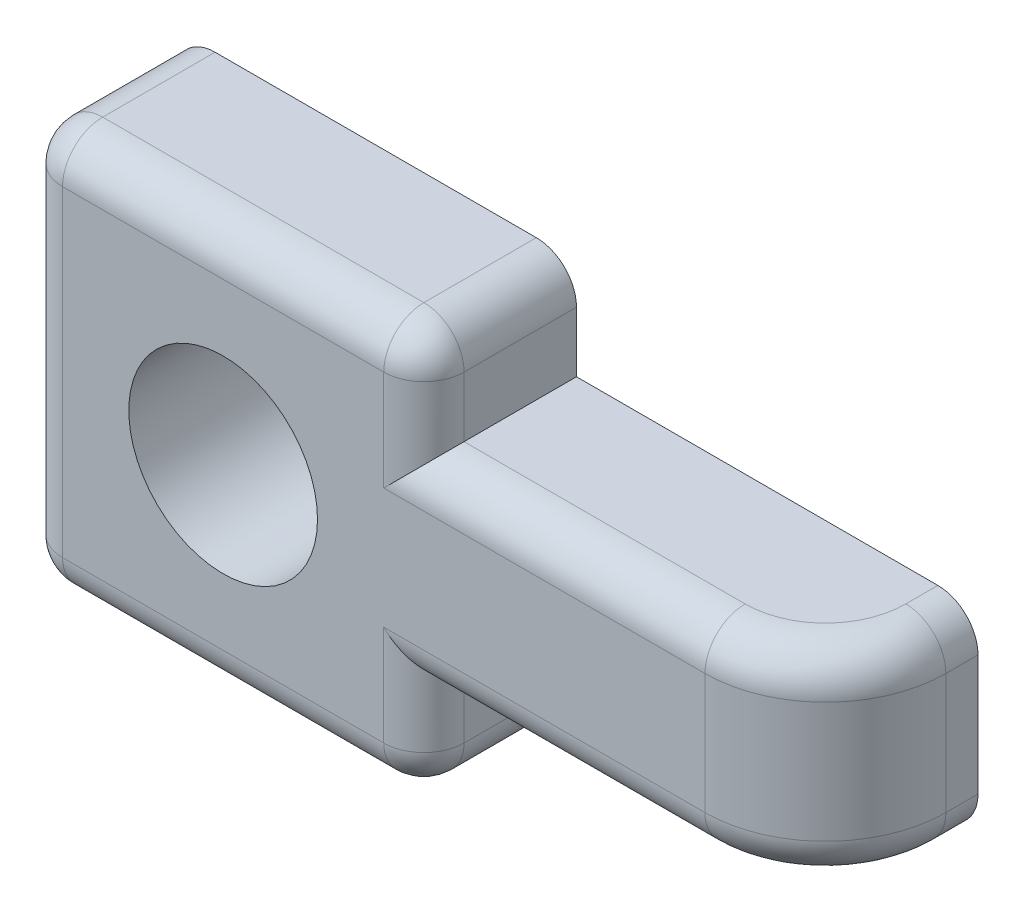
ISO-10303-21;
HEADER;
FILE_DESCRIPTION(('STEP AP214'),'2;1');
FILE_NAME('part.step','',(''),(''),'','','');
FILE_SCHEMA(('AUTOMOTIVE_DESIGN { 1 0 10303 214 1 1 1 1 }'));
ENDSEC;
DATA;
#1=APPLICATION_CONTEXT('core data for automotive mechanical design processes');
#2=APPLICATION_PROTOCOL_DEFINITION('international standard','automotive_design',2000,#1);
#3=PRODUCT_CONTEXT('',#1,'mechanical');
#4=PRODUCT('Part','Part','',(#3));
#5=PRODUCT_RELATED_PRODUCT_CATEGORY('part','',(#4));
#6=PRODUCT_DEFINITION_FORMATION('','',#4);
#7=PRODUCT_DEFINITION_CONTEXT('part definition',#1,'design');
#8=PRODUCT_DEFINITION('design','',#6,#7);
#9=PRODUCT_DEFINITION_SHAPE('','',#8);
#10=(LENGTH_UNIT() NAMED_UNIT(*) SI_UNIT(.MILLI.,.METRE.));
#11=(NAMED_UNIT(*) PLANE_ANGLE_UNIT() SI_UNIT($,.RADIAN.));
#12=(NAMED_UNIT(*) SI_UNIT($,.STERADIAN.) SOLID_ANGLE_UNIT());
#13=UNCERTAINTY_MEASURE_WITH_UNIT(LENGTH_MEASURE(1.E-05),#10,'distance_accuracy_value','');
#14=(GEOMETRIC_REPRESENTATION_CONTEXT(3) GLOBAL_UNCERTAINTY_ASSIGNED_CONTEXT((#13)) GLOBAL_UNIT_ASSIGNED_CONTEXT((#10,
#11,#12)) REPRESENTATION_CONTEXT('',''));
#15=CARTESIAN_POINT('',(0.,0.,0.));
#16=DIRECTION('',(0.,0.,1.));
#17=DIRECTION('',(1.,0.,0.));
#18=AXIS2_PLACEMENT_3D('',#15,#16,#17);
#19=CARTESIAN_POINT('',(0.,-25.,38.));
#20=DIRECTION('',(0.,1.,0.));
#21=DIRECTION('',(0.,0.,1.));
#22=AXIS2_PLACEMENT_3D('',#19,#20,#21);
#23=PLANE('',#22);
#24=DIRECTION('',(1.,0.,0.));
#25=VECTOR('',#24,1.);
#26=CARTESIAN_POINT('',(0.,-25.,0.));
#27=LINE('',#26,#25);
#28=CARTESIAN_POINT('',(50.,-25.,0.));
#29=VERTEX_POINT('',#28);
#30=CARTESIAN_POINT('',(140.,-25.,0.));
#31=VERTEX_POINT('',#30);
#32=EDGE_CURVE('E194',#29,#31,#27,.T.);
#33=ORIENTED_EDGE('',*,*,#32,.T.);
#34=DIRECTION('',(0.,0.,-1.));
#35=VECTOR('',#34,1.);
#36=CARTESIAN_POINT('',(140.,-25.,38.));
#37=LINE('',#36,#35);
#38=CARTESIAN_POINT('',(140.,-25.,8.00000000000002));
#39=VERTEX_POINT('',#38);
#40=EDGE_CURVE('E288',#31,#39,#37,.F.);
#41=ORIENTED_EDGE('',*,*,#40,.T.);
#42=CARTESIAN_POINT('',(120.,-25.,8.00000000000002));
#43=DIRECTION('',(0.,1.,0.));
#44=DIRECTION('',(0.,0.,1.));
#45=AXIS2_PLACEMENT_3D('',#42,#43,#44);
#46=CIRCLE('',#45,20.);
#47=CARTESIAN_POINT('',(120.,-25.,28.));
#48=VERTEX_POINT('',#47);
#49=EDGE_CURVE('E286',#39,#48,#46,.F.);
#50=ORIENTED_EDGE('',*,*,#49,.T.);
#51=DIRECTION('',(1.,0.,0.));
#52=VECTOR('',#51,1.);
#53=CARTESIAN_POINT('',(50.,-25.,28.));
#54=LINE('',#53,#52);
#55=CARTESIAN_POINT('',(50.,-25.,28.));
#56=VERTEX_POINT('',#55);
#57=EDGE_CURVE('E284',#48,#56,#54,.F.);
#58=ORIENTED_EDGE('',*,*,#57,.T.);
#59=DIRECTION('',(0.,0.,-1.));
#60=VECTOR('',#59,1.);
#61=CARTESIAN_POINT('',(50.,-25.,38.));
#62=LINE('',#61,#60);
#63=EDGE_CURVE('E176',#56,#29,#62,.T.);
#64=ORIENTED_EDGE('',*,*,#63,.T.);
#65=EDGE_LOOP('',(#33,#41,#50,#58,#64));
#66=FACE_BOUND('',#65,.T.);
#67=ADVANCED_FACE('F37',(#66),#23,.F.);
#68=CARTESIAN_POINT('',(150.,0.,38.));
#69=DIRECTION('',(-1.,0.,0.));
#70=DIRECTION('',(0.,0.,1.));
#71=AXIS2_PLACEMENT_3D('',#68,#69,#70);
#72=PLANE('',#71);
#73=DIRECTION('',(0.,1.,0.));
#74=VECTOR('',#73,1.);
#75=CARTESIAN_POINT('',(150.,-25.,8.00000000000002));
#76=LINE('',#75,#74);
#77=CARTESIAN_POINT('',(150.,15.,8.00000000000002));
#78=VERTEX_POINT('',#77);
#79=CARTESIAN_POINT('',(150.,-15.,8.00000000000002));
#80=VERTEX_POINT('',#79);
#81=EDGE_CURVE('E242',#78,#80,#76,.F.);
#82=ORIENTED_EDGE('',*,*,#81,.T.);
#83=DIRECTION('',(0.,0.,-1.));
#84=VECTOR('',#83,1.);
#85=CARTESIAN_POINT('',(150.,-15.,38.));
#86=LINE('',#85,#84);
#87=CARTESIAN_POINT('',(150.,-15.,0.));
#88=VERTEX_POINT('',#87);
#89=EDGE_CURVE('E278',#80,#88,#86,.T.);
#90=ORIENTED_EDGE('',*,*,#89,.T.);
#91=DIRECTION('',(0.,1.,0.));
#92=VECTOR('',#91,1.);
#93=CARTESIAN_POINT('',(150.,0.,0.));
#94=LINE('',#93,#92);
#95=CARTESIAN_POINT('',(150.,15.,0.));
#96=VERTEX_POINT('',#95);
#97=EDGE_CURVE('E191',#88,#96,#94,.T.);
#98=ORIENTED_EDGE('',*,*,#97,.T.);
#99=DIRECTION('',(0.,0.,-1.));
#100=VECTOR('',#99,1.);
#101=CARTESIAN_POINT('',(150.,15.,8.00000000000002));
#102=LINE('',#101,#100);
#103=EDGE_CURVE('E276',#96,#78,#102,.F.);
#104=ORIENTED_EDGE('',*,*,#103,.T.);
#105=EDGE_LOOP('',(#82,#90,#98,#104));
#106=FACE_BOUND('',#105,.T.);
#107=ADVANCED_FACE('F364',(#106),#72,.F.);
#108=CARTESIAN_POINT('',(0.,25.,38.));
#109=DIRECTION('',(0.,1.,0.));
#110=DIRECTION('',(0.,0.,1.));
#111=AXIS2_PLACEMENT_3D('',#108,#109,#110);
#112=PLANE('',#111);
#113=CARTESIAN_POINT('',(120.,25.,8.00000000000002));
#114=DIRECTION('',(0.,1.,0.));
#115=DIRECTION('',(0.,0.,1.));
#116=AXIS2_PLACEMENT_3D('',#113,#114,#115);
#117=CIRCLE('',#116,20.);
#118=CARTESIAN_POINT('',(120.,25.,28.));
#119=VERTEX_POINT('',#118);
#120=CARTESIAN_POINT('',(140.,25.,8.00000000000002));
#121=VERTEX_POINT('',#120);
#122=EDGE_CURVE('E54',#119,#121,#117,.T.);
#123=ORIENTED_EDGE('',*,*,#122,.T.);
#124=DIRECTION('',(0.,0.,-1.));
#125=VECTOR('',#124,1.);
#126=CARTESIAN_POINT('',(140.,25.,0.));
#127=LINE('',#126,#125);
#128=CARTESIAN_POINT('',(140.,25.,0.));
#129=VERTEX_POINT('',#128);
#130=EDGE_CURVE('E46',#121,#129,#127,.T.);
#131=ORIENTED_EDGE('',*,*,#130,.T.);
#132=DIRECTION('',(1.,0.,0.));
#133=VECTOR('',#132,1.);
#134=CARTESIAN_POINT('',(0.,25.,0.));
#135=LINE('',#134,#133);
#136=CARTESIAN_POINT('',(50.,25.,0.));
#137=VERTEX_POINT('',#136);
#138=EDGE_CURVE('E183',#137,#129,#135,.T.);
#139=ORIENTED_EDGE('',*,*,#138,.F.);
#140=DIRECTION('',(0.,0.,-1.));
#141=VECTOR('',#140,1.);
#142=CARTESIAN_POINT('',(50.,25.,38.));
#143=LINE('',#142,#141);
#144=CARTESIAN_POINT('',(50.,25.,28.));
#145=VERTEX_POINT('',#144);
#146=EDGE_CURVE('E167',#145,#137,#143,.T.);
#147=ORIENTED_EDGE('',*,*,#146,.F.);
#148=DIRECTION('',(1.,0.,0.));
#149=VECTOR('',#148,1.);
#150=CARTESIAN_POINT('',(0.,25.,28.));
#151=LINE('',#150,#149);
#152=EDGE_CURVE('E59',#145,#119,#151,.T.);
#153=ORIENTED_EDGE('',*,*,#152,.T.);
#154=EDGE_LOOP('',(#123,#131,#139,#147,#153));
#155=FACE_BOUND('',#154,.T.);
#156=ADVANCED_FACE('F190',(#155),#112,.T.);
#157=CARTESIAN_POINT('',(50.,0.,38.));
#158=DIRECTION('',(-1.,0.,0.));
#159=DIRECTION('',(0.,-1.,0.));
#160=AXIS2_PLACEMENT_3D('',#157,#158,#159);
#161=PLANE('',#160);
#162=DIRECTION('',(0.,0.,-1.));
#163=VECTOR('',#162,1.);
#164=CARTESIAN_POINT('',(50.,40.,38.));
#165=LINE('',#164,#163);
#166=CARTESIAN_POINT('',(50.,40.,0.));
#167=VERTEX_POINT('',#166);
#168=CARTESIAN_POINT('',(50.,40.,28.));
#169=VERTEX_POINT('',#168);
#170=EDGE_CURVE('E225',#167,#169,#165,.F.);
#171=ORIENTED_EDGE('',*,*,#170,.T.);
#172=DIRECTION('',(0.,1.,0.));
#173=VECTOR('',#172,1.);
#174=CARTESIAN_POINT('',(50.,25.,28.));
#175=LINE('',#174,#173);
#176=EDGE_CURVE('E11',#169,#145,#175,.F.);
#177=ORIENTED_EDGE('',*,*,#176,.T.);
#178=ORIENTED_EDGE('',*,*,#146,.T.);
#179=DIRECTION('',(0.,1.,0.));
#180=VECTOR('',#179,1.);
#181=CARTESIAN_POINT('',(50.,0.,0.));
#182=LINE('',#181,#180);
#183=EDGE_CURVE('E171',#137,#167,#182,.T.);
#184=ORIENTED_EDGE('',*,*,#183,.T.);
#185=EDGE_LOOP('',(#171,#177,#178,#184));
#186=FACE_BOUND('',#185,.T.);
#187=ADVANCED_FACE('F170',(#186),#161,.F.);
#188=CARTESIAN_POINT('',(0.,50.,38.));
#189=DIRECTION('',(0.,-1.,0.));
#190=DIRECTION('',(0.,0.,-1.));
#191=AXIS2_PLACEMENT_3D('',#188,#189,#190);
#192=PLANE('',#191);
#193=DIRECTION('',(0.,0.,-1.));
#194=VECTOR('',#193,1.);
#195=CARTESIAN_POINT('',(-40.,50.,38.));
#196=LINE('',#195,#194);
#197=CARTESIAN_POINT('',(-40.,50.,0.));
#198=VERTEX_POINT('',#197);
#199=CARTESIAN_POINT('',(-40.,50.,28.));
#200=VERTEX_POINT('',#199);
#201=EDGE_CURVE('E175',#198,#200,#196,.F.);
#202=ORIENTED_EDGE('',*,*,#201,.T.);
#203=DIRECTION('',(-1.,0.,0.));
#204=VECTOR('',#203,1.);
#205=CARTESIAN_POINT('',(40.,50.,28.));
#206=LINE('',#205,#204);
#207=CARTESIAN_POINT('',(40.,50.,28.));
#208=VERTEX_POINT('',#207);
#209=EDGE_CURVE('E272',#200,#208,#206,.F.);
#210=ORIENTED_EDGE('',*,*,#209,.T.);
#211=DIRECTION('',(0.,0.,-1.));
#212=VECTOR('',#211,1.);
#213=CARTESIAN_POINT('',(40.,50.,38.));
#214=LINE('',#213,#212);
#215=CARTESIAN_POINT('',(40.,50.,0.));
#216=VERTEX_POINT('',#215);
#217=EDGE_CURVE('E216',#208,#216,#214,.T.);
#218=ORIENTED_EDGE('',*,*,#217,.T.);
#219=DIRECTION('',(-1.,0.,0.));
#220=VECTOR('',#219,1.);
#221=CARTESIAN_POINT('',(0.,50.,0.));
#222=LINE('',#221,#220);
#223=EDGE_CURVE('E188',#216,#198,#222,.T.);
#224=ORIENTED_EDGE('',*,*,#223,.T.);
#225=EDGE_LOOP('',(#202,#210,#218,#224));
#226=FACE_BOUND('',#225,.T.);
#227=ADVANCED_FACE('F500',(#226),#192,.F.);
#228=CARTESIAN_POINT('',(-50.,0.,38.));
#229=DIRECTION('',(-1.,0.,0.));
#230=DIRECTION('',(0.,-1.,0.));
#231=AXIS2_PLACEMENT_3D('',#228,#229,#230);
#232=PLANE('',#231);
#233=DIRECTION('',(0.,0.,-1.));
#234=VECTOR('',#233,1.);
#235=CARTESIAN_POINT('',(-50.,-40.,38.));
#236=LINE('',#235,#234);
#237=CARTESIAN_POINT('',(-50.,-40.,0.));
#238=VERTEX_POINT('',#237);
#239=CARTESIAN_POINT('',(-50.,-40.,28.));
#240=VERTEX_POINT('',#239);
#241=EDGE_CURVE('E236',#238,#240,#236,.F.);
#242=ORIENTED_EDGE('',*,*,#241,.T.);
#243=DIRECTION('',(0.,1.,0.));
#244=VECTOR('',#243,1.);
#245=CARTESIAN_POINT('',(-50.,0.,28.));
#246=LINE('',#245,#244);
#247=CARTESIAN_POINT('',(-50.,40.,28.));
#248=VERTEX_POINT('',#247);
#249=EDGE_CURVE('E268',#240,#248,#246,.T.);
#250=ORIENTED_EDGE('',*,*,#249,.T.);
#251=DIRECTION('',(0.,0.,-1.));
#252=VECTOR('',#251,1.);
#253=CARTESIAN_POINT('',(-50.,40.,0.));
#254=LINE('',#253,#252);
#255=CARTESIAN_POINT('',(-50.,40.,0.));
#256=VERTEX_POINT('',#255);
#257=EDGE_CURVE('E234',#248,#256,#254,.T.);
#258=ORIENTED_EDGE('',*,*,#257,.T.);
#259=DIRECTION('',(0.,1.,0.));
#260=VECTOR('',#259,1.);
#261=CARTESIAN_POINT('',(-50.,0.,0.));
#262=LINE('',#261,#260);
#263=EDGE_CURVE('E200',#238,#256,#262,.T.);
#264=ORIENTED_EDGE('',*,*,#263,.F.);
#265=EDGE_LOOP('',(#242,#250,#258,#264));
#266=FACE_BOUND('',#265,.T.);
#267=ADVANCED_FACE('F485',(#266),#232,.T.);
#268=CARTESIAN_POINT('',(0.,-50.,38.));
#269=DIRECTION('',(0.,-1.,0.));
#270=DIRECTION('',(0.,0.,-1.));
#271=AXIS2_PLACEMENT_3D('',#268,#269,#270);
#272=PLANE('',#271);
#273=DIRECTION('',(0.,0.,-1.));
#274=VECTOR('',#273,1.);
#275=CARTESIAN_POINT('',(40.,-50.,38.));
#276=LINE('',#275,#274);
#277=CARTESIAN_POINT('',(40.,-50.,0.));
#278=VERTEX_POINT('',#277);
#279=CARTESIAN_POINT('',(40.,-50.,28.));
#280=VERTEX_POINT('',#279);
#281=EDGE_CURVE('E231',#278,#280,#276,.F.);
#282=ORIENTED_EDGE('',*,*,#281,.T.);
#283=DIRECTION('',(-1.,0.,0.));
#284=VECTOR('',#283,1.);
#285=CARTESIAN_POINT('',(0.,-50.,28.));
#286=LINE('',#285,#284);
#287=CARTESIAN_POINT('',(-40.,-50.,28.));
#288=VERTEX_POINT('',#287);
#289=EDGE_CURVE('E264',#280,#288,#286,.T.);
#290=ORIENTED_EDGE('',*,*,#289,.T.);
#291=DIRECTION('',(0.,0.,-1.));
#292=VECTOR('',#291,1.);
#293=CARTESIAN_POINT('',(-40.,-50.,38.));
#294=LINE('',#293,#292);
#295=CARTESIAN_POINT('',(-40.,-50.,0.));
#296=VERTEX_POINT('',#295);
#297=EDGE_CURVE('E229',#288,#296,#294,.T.);
#298=ORIENTED_EDGE('',*,*,#297,.T.);
#299=DIRECTION('',(-1.,0.,0.));
#300=VECTOR('',#299,1.);
#301=CARTESIAN_POINT('',(0.,-50.,0.));
#302=LINE('',#301,#300);
#303=EDGE_CURVE('E203',#278,#296,#302,.T.);
#304=ORIENTED_EDGE('',*,*,#303,.F.);
#305=EDGE_LOOP('',(#282,#290,#298,#304));
#306=FACE_BOUND('',#305,.T.);
#307=ADVANCED_FACE('F479',(#306),#272,.T.);
#308=CARTESIAN_POINT('',(50.,0.,38.));
#309=DIRECTION('',(-1.,0.,0.));
#310=DIRECTION('',(0.,-1.,0.));
#311=AXIS2_PLACEMENT_3D('',#308,#309,#310);
#312=PLANE('',#311);
#313=ORIENTED_EDGE('',*,*,#63,.F.);
#314=DIRECTION('',(0.,1.,0.));
#315=VECTOR('',#314,1.);
#316=CARTESIAN_POINT('',(50.,-40.,28.));
#317=LINE('',#316,#315);
#318=CARTESIAN_POINT('',(50.,-40.,28.));
#319=VERTEX_POINT('',#318);
#320=EDGE_CURVE('E260',#56,#319,#317,.F.);
#321=ORIENTED_EDGE('',*,*,#320,.T.);
#322=DIRECTION('',(0.,0.,-1.));
#323=VECTOR('',#322,1.);
#324=CARTESIAN_POINT('',(50.,-40.,0.));
#325=LINE('',#324,#323);
#326=CARTESIAN_POINT('',(50.,-40.,0.));
#327=VERTEX_POINT('',#326);
#328=EDGE_CURVE('E227',#319,#327,#325,.T.);
#329=ORIENTED_EDGE('',*,*,#328,.T.);
#330=DIRECTION('',(0.,1.,0.));
#331=VECTOR('',#330,1.);
#332=CARTESIAN_POINT('',(50.,0.,0.));
#333=LINE('',#332,#331);
#334=EDGE_CURVE('E206',#327,#29,#333,.T.);
#335=ORIENTED_EDGE('',*,*,#334,.T.);
#336=EDGE_LOOP('',(#313,#321,#329,#335));
#337=FACE_BOUND('',#336,.T.);
#338=ADVANCED_FACE('F361',(#337),#312,.F.);
#339=CARTESIAN_POINT('',(0.,0.,38.));
#340=DIRECTION('',(0.,0.,-1.));
#341=DIRECTION('',(-1.,0.,0.));
#342=AXIS2_PLACEMENT_3D('',#339,#340,#341);
#343=CYLINDRICAL_SURFACE('',#342,23.5);
#344=CARTESIAN_POINT('',(0.,0.,38.));
#345=DIRECTION('',(0.,0.,1.));
#346=DIRECTION('',(1.,0.,0.));
#347=AXIS2_PLACEMENT_3D('',#344,#345,#346);
#348=CIRCLE('',#347,23.5);
#349=CARTESIAN_POINT('',(23.5,0.,38.));
#350=VERTEX_POINT('',#349);
#351=EDGE_CURVE('E212',#350,#350,#348,.T.);
#352=ORIENTED_EDGE('',*,*,#351,.T.);
#353=EDGE_LOOP('',(#352));
#354=FACE_BOUND('',#353,.T.);
#355=CARTESIAN_POINT('',(0.,0.,0.));
#356=DIRECTION('',(0.,0.,1.));
#357=DIRECTION('',(1.,0.,0.));
#358=AXIS2_PLACEMENT_3D('',#355,#356,#357);
#359=CIRCLE('',#358,23.5);
#360=CARTESIAN_POINT('',(23.5,0.,0.));
#361=VERTEX_POINT('',#360);
#362=EDGE_CURVE('E209',#361,#361,#359,.T.);
#363=ORIENTED_EDGE('',*,*,#362,.F.);
#364=EDGE_LOOP('',(#363));
#365=FACE_BOUND('',#364,.T.);
#366=ADVANCED_FACE('F348',(#354,#365),#343,.F.);
#367=CARTESIAN_POINT('',(0.,0.,38.));
#368=DIRECTION('',(0.,0.,1.));
#369=DIRECTION('',(1.,0.,0.));
#370=AXIS2_PLACEMENT_3D('',#367,#368,#369);
#371=PLANE('',#370);
#372=DIRECTION('',(0.,1.,0.));
#373=VECTOR('',#372,1.);
#374=CARTESIAN_POINT('',(40.,-25.,38.));
#375=LINE('',#374,#373);
#376=CARTESIAN_POINT('',(40.,-40.,38.));
#377=VERTEX_POINT('',#376);
#378=CARTESIAN_POINT('',(40.,-15.,38.));
#379=VERTEX_POINT('',#378);
#380=EDGE_CURVE('E255',#377,#379,#375,.T.);
#381=ORIENTED_EDGE('',*,*,#380,.T.);
#382=DIRECTION('',(1.,0.,0.));
#383=VECTOR('',#382,1.);
#384=CARTESIAN_POINT('',(120.,-15.,38.));
#385=LINE('',#384,#383);
#386=CARTESIAN_POINT('',(120.,-15.,38.));
#387=VERTEX_POINT('',#386);
#388=EDGE_CURVE('E258',#379,#387,#385,.T.);
#389=ORIENTED_EDGE('',*,*,#388,.T.);
#390=DIRECTION('',(0.,1.,0.));
#391=VECTOR('',#390,1.);
#392=CARTESIAN_POINT('',(120.,25.,38.));
#393=LINE('',#392,#391);
#394=CARTESIAN_POINT('',(120.,15.,38.));
#395=VERTEX_POINT('',#394);
#396=EDGE_CURVE('E239',#387,#395,#393,.T.);
#397=ORIENTED_EDGE('',*,*,#396,.T.);
#398=DIRECTION('',(1.,0.,0.));
#399=VECTOR('',#398,1.);
#400=CARTESIAN_POINT('',(0.,15.,38.));
#401=LINE('',#400,#399);
#402=CARTESIAN_POINT('',(40.,15.,38.));
#403=VERTEX_POINT('',#402);
#404=EDGE_CURVE('E245',#395,#403,#401,.F.);
#405=ORIENTED_EDGE('',*,*,#404,.T.);
#406=DIRECTION('',(0.,1.,0.));
#407=VECTOR('',#406,1.);
#408=CARTESIAN_POINT('',(40.,40.,38.));
#409=LINE('',#408,#407);
#410=CARTESIAN_POINT('',(40.,40.,38.));
#411=VERTEX_POINT('',#410);
#412=EDGE_CURVE('E247',#403,#411,#409,.T.);
#413=ORIENTED_EDGE('',*,*,#412,.T.);
#414=DIRECTION('',(-1.,0.,0.));
#415=VECTOR('',#414,1.);
#416=CARTESIAN_POINT('',(-40.,40.,38.));
#417=LINE('',#416,#415);
#418=CARTESIAN_POINT('',(-40.,40.,38.));
#419=VERTEX_POINT('',#418);
#420=EDGE_CURVE('E249',#411,#419,#417,.T.);
#421=ORIENTED_EDGE('',*,*,#420,.T.);
#422=DIRECTION('',(0.,1.,0.));
#423=VECTOR('',#422,1.);
#424=CARTESIAN_POINT('',(-40.,0.,38.));
#425=LINE('',#424,#423);
#426=CARTESIAN_POINT('',(-40.,-40.,38.));
#427=VERTEX_POINT('',#426);
#428=EDGE_CURVE('E251',#419,#427,#425,.F.);
#429=ORIENTED_EDGE('',*,*,#428,.T.);
#430=DIRECTION('',(-1.,0.,0.));
#431=VECTOR('',#430,1.);
#432=CARTESIAN_POINT('',(0.,-40.,38.));
#433=LINE('',#432,#431);
#434=EDGE_CURVE('E253',#427,#377,#433,.F.);
#435=ORIENTED_EDGE('',*,*,#434,.T.);
#436=EDGE_LOOP('',(#381,#389,#397,#405,#413,#421,#429,#435));
#437=FACE_BOUND('',#436,.T.);
#438=ORIENTED_EDGE('',*,*,#351,.F.);
#439=EDGE_LOOP('',(#438));
#440=FACE_BOUND('',#439,.T.);
#441=ADVANCED_FACE('F351',(#437,#440),#371,.T.);
#442=CARTESIAN_POINT('',(0.,0.,0.));
#443=DIRECTION('',(0.,0.,1.));
#444=DIRECTION('',(1.,0.,0.));
#445=AXIS2_PLACEMENT_3D('',#442,#443,#444);
#446=PLANE('',#445);
#447=ORIENTED_EDGE('',*,*,#97,.F.);
#448=CARTESIAN_POINT('',(140.,-15.,0.));
#449=DIRECTION('',(0.,0.,1.));
#450=DIRECTION('',(1.,0.,0.));
#451=AXIS2_PLACEMENT_3D('',#448,#449,#450);
#452=CIRCLE('',#451,10.);
#453=EDGE_CURVE('E282',#88,#31,#452,.F.);
#454=ORIENTED_EDGE('',*,*,#453,.T.);
#455=ORIENTED_EDGE('',*,*,#32,.F.);
#456=ORIENTED_EDGE('',*,*,#334,.F.);
#457=CARTESIAN_POINT('',(40.,-40.,0.));
#458=DIRECTION('',(0.,0.,1.));
#459=DIRECTION('',(1.,0.,0.));
#460=AXIS2_PLACEMENT_3D('',#457,#458,#459);
#461=CIRCLE('',#460,10.);
#462=EDGE_CURVE('E222',#327,#278,#461,.F.);
#463=ORIENTED_EDGE('',*,*,#462,.T.);
#464=ORIENTED_EDGE('',*,*,#303,.T.);
#465=CARTESIAN_POINT('',(-40.,-40.,0.));
#466=DIRECTION('',(0.,0.,1.));
#467=DIRECTION('',(1.,0.,0.));
#468=AXIS2_PLACEMENT_3D('',#465,#466,#467);
#469=CIRCLE('',#468,10.);
#470=EDGE_CURVE('E220',#296,#238,#469,.F.);
#471=ORIENTED_EDGE('',*,*,#470,.T.);
#472=ORIENTED_EDGE('',*,*,#263,.T.);
#473=CARTESIAN_POINT('',(-40.,40.,0.));
#474=DIRECTION('',(0.,0.,1.));
#475=DIRECTION('',(1.,0.,0.));
#476=AXIS2_PLACEMENT_3D('',#473,#474,#475);
#477=CIRCLE('',#476,10.);
#478=EDGE_CURVE('E218',#256,#198,#477,.F.);
#479=ORIENTED_EDGE('',*,*,#478,.T.);
#480=ORIENTED_EDGE('',*,*,#223,.F.);
#481=CARTESIAN_POINT('',(40.,40.,0.));
#482=DIRECTION('',(0.,0.,1.));
#483=DIRECTION('',(1.,0.,0.));
#484=AXIS2_PLACEMENT_3D('',#481,#482,#483);
#485=CIRCLE('',#484,10.);
#486=EDGE_CURVE('E187',#216,#167,#485,.F.);
#487=ORIENTED_EDGE('',*,*,#486,.T.);
#488=ORIENTED_EDGE('',*,*,#183,.F.);
#489=ORIENTED_EDGE('',*,*,#138,.T.);
#490=CARTESIAN_POINT('',(140.,15.,0.));
#491=DIRECTION('',(0.,0.,1.));
#492=DIRECTION('',(1.,0.,0.));
#493=AXIS2_PLACEMENT_3D('',#490,#491,#492);
#494=CIRCLE('',#493,10.);
#495=EDGE_CURVE('E280',#129,#96,#494,.F.);
#496=ORIENTED_EDGE('',*,*,#495,.T.);
#497=EDGE_LOOP('',(#447,#454,#455,#456,#463,#464,#471,#472,#479,#480,#487,#488,#489,#496));
#498=FACE_BOUND('',#497,.T.);
#499=ORIENTED_EDGE('',*,*,#362,.T.);
#500=EDGE_LOOP('',(#499));
#501=FACE_BOUND('',#500,.T.);
#502=ADVANCED_FACE('F181',(#498,#501),#446,.F.);
#503=CARTESIAN_POINT('',(40.,40.,38.));
#504=DIRECTION('',(0.,0.,-1.));
#505=DIRECTION('',(-1.,0.,0.));
#506=AXIS2_PLACEMENT_3D('',#503,#504,#505);
#507=CYLINDRICAL_SURFACE('',#506,10.);
#508=ORIENTED_EDGE('',*,*,#217,.F.);
#509=CARTESIAN_POINT('',(40.,40.,28.));
#510=DIRECTION('',(0.,0.,-1.));
#511=DIRECTION('',(-1.,0.,0.));
#512=AXIS2_PLACEMENT_3D('',#509,#510,#511);
#513=CIRCLE('',#512,10.);
#514=EDGE_CURVE('E274',#208,#169,#513,.T.);
#515=ORIENTED_EDGE('',*,*,#514,.T.);
#516=ORIENTED_EDGE('',*,*,#170,.F.);
#517=ORIENTED_EDGE('',*,*,#486,.F.);
#518=EDGE_LOOP('',(#508,#515,#516,#517));
#519=FACE_BOUND('',#518,.T.);
#520=ADVANCED_FACE('F359',(#519),#507,.T.);
#521=CARTESIAN_POINT('',(40.,-40.,38.));
#522=DIRECTION('',(0.,0.,1.));
#523=DIRECTION('',(1.,0.,0.));
#524=AXIS2_PLACEMENT_3D('',#521,#522,#523);
#525=CYLINDRICAL_SURFACE('',#524,10.);
#526=ORIENTED_EDGE('',*,*,#328,.F.);
#527=CARTESIAN_POINT('',(40.,-40.,28.));
#528=DIRECTION('',(0.,0.,1.));
#529=DIRECTION('',(1.,0.,0.));
#530=AXIS2_PLACEMENT_3D('',#527,#528,#529);
#531=CIRCLE('',#530,10.);
#532=EDGE_CURVE('E262',#319,#280,#531,.F.);
#533=ORIENTED_EDGE('',*,*,#532,.T.);
#534=ORIENTED_EDGE('',*,*,#281,.F.);
#535=ORIENTED_EDGE('',*,*,#462,.F.);
#536=EDGE_LOOP('',(#526,#533,#534,#535));
#537=FACE_BOUND('',#536,.T.);
#538=ADVANCED_FACE('F375',(#537),#525,.T.);
#539=CARTESIAN_POINT('',(-40.,-40.,38.));
#540=DIRECTION('',(0.,0.,-1.));
#541=DIRECTION('',(-1.,0.,0.));
#542=AXIS2_PLACEMENT_3D('',#539,#540,#541);
#543=CYLINDRICAL_SURFACE('',#542,10.);
#544=ORIENTED_EDGE('',*,*,#297,.F.);
#545=CARTESIAN_POINT('',(-40.,-40.,28.));
#546=DIRECTION('',(0.,0.,-1.));
#547=DIRECTION('',(-1.,0.,0.));
#548=AXIS2_PLACEMENT_3D('',#545,#546,#547);
#549=CIRCLE('',#548,10.);
#550=EDGE_CURVE('E266',#288,#240,#549,.T.);
#551=ORIENTED_EDGE('',*,*,#550,.T.);
#552=ORIENTED_EDGE('',*,*,#241,.F.);
#553=ORIENTED_EDGE('',*,*,#470,.F.);
#554=EDGE_LOOP('',(#544,#551,#552,#553));
#555=FACE_BOUND('',#554,.T.);
#556=ADVANCED_FACE('F379',(#555),#543,.T.);
#557=CARTESIAN_POINT('',(-40.,40.,38.));
#558=DIRECTION('',(0.,0.,1.));
#559=DIRECTION('',(1.,0.,0.));
#560=AXIS2_PLACEMENT_3D('',#557,#558,#559);
#561=CYLINDRICAL_SURFACE('',#560,10.);
#562=ORIENTED_EDGE('',*,*,#257,.F.);
#563=CARTESIAN_POINT('',(-40.,40.,28.));
#564=DIRECTION('',(0.,0.,1.));
#565=DIRECTION('',(1.,0.,0.));
#566=AXIS2_PLACEMENT_3D('',#563,#564,#565);
#567=CIRCLE('',#566,10.);
#568=EDGE_CURVE('E270',#248,#200,#567,.F.);
#569=ORIENTED_EDGE('',*,*,#568,.T.);
#570=ORIENTED_EDGE('',*,*,#201,.F.);
#571=ORIENTED_EDGE('',*,*,#478,.F.);
#572=EDGE_LOOP('',(#562,#569,#570,#571));
#573=FACE_BOUND('',#572,.T.);
#574=ADVANCED_FACE('F383',(#573),#561,.T.);
#575=CARTESIAN_POINT('',(120.,0.,8.00000000000002));
#576=DIRECTION('',(0.,-1.,0.));
#577=DIRECTION('',(0.,0.,-1.));
#578=AXIS2_PLACEMENT_3D('',#575,#576,#577);
#579=CYLINDRICAL_SURFACE('',#578,30.);
#580=ORIENTED_EDGE('',*,*,#396,.F.);
#581=CARTESIAN_POINT('',(120.,-15.,8.00000000000002));
#582=DIRECTION('',(0.,1.,0.));
#583=DIRECTION('',(0.,0.,1.));
#584=AXIS2_PLACEMENT_3D('',#581,#582,#583);
#585=CIRCLE('',#584,30.);
#586=EDGE_CURVE('E292',#387,#80,#585,.T.);
#587=ORIENTED_EDGE('',*,*,#586,.T.);
#588=ORIENTED_EDGE('',*,*,#81,.F.);
#589=CARTESIAN_POINT('',(120.,15.,8.00000000000002));
#590=DIRECTION('',(0.,1.,0.));
#591=DIRECTION('',(0.,0.,1.));
#592=AXIS2_PLACEMENT_3D('',#589,#590,#591);
#593=CIRCLE('',#592,30.);
#594=EDGE_CURVE('E290',#78,#395,#593,.F.);
#595=ORIENTED_EDGE('',*,*,#594,.T.);
#596=EDGE_LOOP('',(#580,#587,#588,#595));
#597=FACE_BOUND('',#596,.T.);
#598=ADVANCED_FACE('F387',(#597),#579,.T.);
#599=CARTESIAN_POINT('',(140.,15.,38.));
#600=DIRECTION('',(0.,0.,1.));
#601=DIRECTION('',(1.,0.,0.));
#602=AXIS2_PLACEMENT_3D('',#599,#600,#601);
#603=CYLINDRICAL_SURFACE('',#602,10.);
#604=ORIENTED_EDGE('',*,*,#495,.F.);
#605=ORIENTED_EDGE('',*,*,#130,.F.);
#606=CARTESIAN_POINT('',(140.,15.,8.00000000000002));
#607=DIRECTION('',(0.,0.,1.));
#608=DIRECTION('',(1.,0.,0.));
#609=AXIS2_PLACEMENT_3D('',#606,#607,#608);
#610=CIRCLE('',#609,10.);
#611=EDGE_CURVE('E41',#78,#121,#610,.T.);
#612=ORIENTED_EDGE('',*,*,#611,.F.);
#613=ORIENTED_EDGE('',*,*,#103,.F.);
#614=EDGE_LOOP('',(#604,#605,#612,#613));
#615=FACE_BOUND('',#614,.T.);
#616=ADVANCED_FACE('F39',(#615),#603,.T.);
#617=CARTESIAN_POINT('',(120.,15.,8.00000000000002));
#618=DIRECTION('',(0.,1.,0.));
#619=DIRECTION('',(0.,0.,1.));
#620=AXIS2_PLACEMENT_3D('',#617,#618,#619);
#621=TOROIDAL_SURFACE('',#620,20.,10.);
#622=ORIENTED_EDGE('',*,*,#611,.T.);
#623=ORIENTED_EDGE('',*,*,#122,.F.);
#624=CARTESIAN_POINT('',(120.,15.,28.));
#625=DIRECTION('',(-1.,0.,0.));
#626=DIRECTION('',(0.,0.,1.));
#627=AXIS2_PLACEMENT_3D('',#624,#625,#626);
#628=CIRCLE('',#627,10.);
#629=EDGE_CURVE('E331',#395,#119,#628,.T.);
#630=ORIENTED_EDGE('',*,*,#629,.F.);
#631=ORIENTED_EDGE('',*,*,#594,.F.);
#632=EDGE_LOOP('',(#622,#623,#630,#631));
#633=FACE_BOUND('',#632,.T.);
#634=ADVANCED_FACE('F442',(#633),#621,.T.);
#635=CARTESIAN_POINT('',(0.,15.,28.));
#636=DIRECTION('',(1.,0.,0.));
#637=DIRECTION('',(0.,0.,-1.));
#638=AXIS2_PLACEMENT_3D('',#635,#636,#637);
#639=CYLINDRICAL_SURFACE('',#638,10.);
#640=ORIENTED_EDGE('',*,*,#629,.T.);
#641=ORIENTED_EDGE('',*,*,#152,.F.);
#642=CARTESIAN_POINT('',(40.,15.,28.));
#643=DIRECTION('',(0.707106781186548,-0.707106781186547,0.));
#644=DIRECTION('',(-0.707106781186547,-0.707106781186548,0.));
#645=AXIS2_PLACEMENT_3D('',#642,#643,#644);
#646=ELLIPSE('',#645,14.1421356237309,10.);
#647=EDGE_CURVE('E329',#403,#145,#646,.F.);
#648=ORIENTED_EDGE('',*,*,#647,.F.);
#649=ORIENTED_EDGE('',*,*,#404,.F.);
#650=EDGE_LOOP('',(#640,#641,#648,#649));
#651=FACE_BOUND('',#650,.T.);
#652=ADVANCED_FACE('F439',(#651),#639,.T.);
#653=CARTESIAN_POINT('',(40.,0.,28.));
#654=DIRECTION('',(0.,-1.,0.));
#655=DIRECTION('',(1.,0.,0.));
#656=AXIS2_PLACEMENT_3D('',#653,#654,#655);
#657=CYLINDRICAL_SURFACE('',#656,10.);
#658=ORIENTED_EDGE('',*,*,#647,.T.);
#659=ORIENTED_EDGE('',*,*,#176,.F.);
#660=CARTESIAN_POINT('',(40.,40.,28.));
#661=DIRECTION('',(0.,1.,0.));
#662=DIRECTION('',(0.,0.,1.));
#663=AXIS2_PLACEMENT_3D('',#660,#661,#662);
#664=CIRCLE('',#663,10.);
#665=EDGE_CURVE('E326',#411,#169,#664,.T.);
#666=ORIENTED_EDGE('',*,*,#665,.F.);
#667=ORIENTED_EDGE('',*,*,#412,.F.);
#668=EDGE_LOOP('',(#658,#659,#666,#667));
#669=FACE_BOUND('',#668,.T.);
#670=ADVANCED_FACE('F435',(#669),#657,.T.);
#671=CARTESIAN_POINT('',(40.,40.,28.));
#672=DIRECTION('',(0.,0.,1.));
#673=DIRECTION('',(1.,0.,0.));
#674=AXIS2_PLACEMENT_3D('',#671,#672,#673);
#675=SPHERICAL_SURFACE('',#674,10.);
#676=ORIENTED_EDGE('',*,*,#665,.T.);
#677=ORIENTED_EDGE('',*,*,#514,.F.);
#678=CARTESIAN_POINT('',(40.,40.,28.));
#679=DIRECTION('',(-1.,0.,0.));
#680=DIRECTION('',(0.,0.,1.));
#681=AXIS2_PLACEMENT_3D('',#678,#679,#680);
#682=CIRCLE('',#681,10.);
#683=EDGE_CURVE('E323',#411,#208,#682,.T.);
#684=ORIENTED_EDGE('',*,*,#683,.F.);
#685=EDGE_LOOP('',(#676,#677,#684));
#686=FACE_BOUND('',#685,.T.);
#687=ADVANCED_FACE('F431',(#686),#675,.T.);
#688=CARTESIAN_POINT('',(0.,40.,28.));
#689=DIRECTION('',(1.,0.,0.));
#690=DIRECTION('',(0.,0.,-1.));
#691=AXIS2_PLACEMENT_3D('',#688,#689,#690);
#692=CYLINDRICAL_SURFACE('',#691,10.);
#693=ORIENTED_EDGE('',*,*,#683,.T.);
#694=ORIENTED_EDGE('',*,*,#209,.F.);
#695=CARTESIAN_POINT('',(-40.,40.,28.));
#696=DIRECTION('',(-1.,0.,0.));
#697=DIRECTION('',(0.,0.,1.));
#698=AXIS2_PLACEMENT_3D('',#695,#696,#697);
#699=CIRCLE('',#698,10.);
#700=EDGE_CURVE('E320',#419,#200,#699,.T.);
#701=ORIENTED_EDGE('',*,*,#700,.F.);
#702=ORIENTED_EDGE('',*,*,#420,.F.);
#703=EDGE_LOOP('',(#693,#694,#701,#702));
#704=FACE_BOUND('',#703,.T.);
#705=ADVANCED_FACE('F427',(#704),#692,.T.);
#706=CARTESIAN_POINT('',(-40.,40.,28.));
#707=DIRECTION('',(0.,0.,1.));
#708=DIRECTION('',(1.,0.,0.));
#709=AXIS2_PLACEMENT_3D('',#706,#707,#708);
#710=SPHERICAL_SURFACE('',#709,10.);
#711=ORIENTED_EDGE('',*,*,#700,.T.);
#712=ORIENTED_EDGE('',*,*,#568,.F.);
#713=CARTESIAN_POINT('',(-40.,40.,28.));
#714=DIRECTION('',(0.,-1.,0.));
#715=DIRECTION('',(0.,0.,-1.));
#716=AXIS2_PLACEMENT_3D('',#713,#714,#715);
#717=CIRCLE('',#716,10.);
#718=EDGE_CURVE('E317',#419,#248,#717,.T.);
#719=ORIENTED_EDGE('',*,*,#718,.F.);
#720=EDGE_LOOP('',(#711,#712,#719));
#721=FACE_BOUND('',#720,.T.);
#722=ADVANCED_FACE('F423',(#721),#710,.T.);
#723=CARTESIAN_POINT('',(-40.,0.,28.));
#724=DIRECTION('',(0.,1.,0.));
#725=DIRECTION('',(-1.,0.,0.));
#726=AXIS2_PLACEMENT_3D('',#723,#724,#725);
#727=CYLINDRICAL_SURFACE('',#726,10.);
#728=ORIENTED_EDGE('',*,*,#718,.T.);
#729=ORIENTED_EDGE('',*,*,#249,.F.);
#730=CARTESIAN_POINT('',(-40.,-40.,28.));
#731=DIRECTION('',(0.,-1.,0.));
#732=DIRECTION('',(0.,0.,-1.));
#733=AXIS2_PLACEMENT_3D('',#730,#731,#732);
#734=CIRCLE('',#733,10.);
#735=EDGE_CURVE('E314',#427,#240,#734,.T.);
#736=ORIENTED_EDGE('',*,*,#735,.F.);
#737=ORIENTED_EDGE('',*,*,#428,.F.);
#738=EDGE_LOOP('',(#728,#729,#736,#737));
#739=FACE_BOUND('',#738,.T.);
#740=ADVANCED_FACE('F419',(#739),#727,.T.);
#741=CARTESIAN_POINT('',(-40.,-40.,28.));
#742=DIRECTION('',(0.,0.,1.));
#743=DIRECTION('',(1.,0.,0.));
#744=AXIS2_PLACEMENT_3D('',#741,#742,#743);
#745=SPHERICAL_SURFACE('',#744,10.);
#746=ORIENTED_EDGE('',*,*,#735,.T.);
#747=ORIENTED_EDGE('',*,*,#550,.F.);
#748=CARTESIAN_POINT('',(-40.,-40.,28.));
#749=DIRECTION('',(1.,0.,0.));
#750=DIRECTION('',(0.,0.,-1.));
#751=AXIS2_PLACEMENT_3D('',#748,#749,#750);
#752=CIRCLE('',#751,10.);
#753=EDGE_CURVE('E311',#427,#288,#752,.T.);
#754=ORIENTED_EDGE('',*,*,#753,.F.);
#755=EDGE_LOOP('',(#746,#747,#754));
#756=FACE_BOUND('',#755,.T.);
#757=ADVANCED_FACE('F415',(#756),#745,.T.);
#758=CARTESIAN_POINT('',(140.,-15.,38.));
#759=DIRECTION('',(0.,0.,-1.));
#760=DIRECTION('',(-1.,0.,0.));
#761=AXIS2_PLACEMENT_3D('',#758,#759,#760);
#762=CYLINDRICAL_SURFACE('',#761,10.);
#763=ORIENTED_EDGE('',*,*,#453,.F.);
#764=ORIENTED_EDGE('',*,*,#89,.F.);
#765=CARTESIAN_POINT('',(140.,-15.,8.00000000000002));
#766=DIRECTION('',(0.,0.,1.));
#767=DIRECTION('',(1.,0.,0.));
#768=AXIS2_PLACEMENT_3D('',#765,#766,#767);
#769=CIRCLE('',#768,10.);
#770=EDGE_CURVE('E308',#39,#80,#769,.T.);
#771=ORIENTED_EDGE('',*,*,#770,.F.);
#772=ORIENTED_EDGE('',*,*,#40,.F.);
#773=EDGE_LOOP('',(#763,#764,#771,#772));
#774=FACE_BOUND('',#773,.T.);
#775=ADVANCED_FACE('F411',(#774),#762,.T.);
#776=CARTESIAN_POINT('',(0.,-40.,28.));
#777=DIRECTION('',(-1.,0.,0.));
#778=DIRECTION('',(0.,0.,1.));
#779=AXIS2_PLACEMENT_3D('',#776,#777,#778);
#780=CYLINDRICAL_SURFACE('',#779,10.);
#781=ORIENTED_EDGE('',*,*,#753,.T.);
#782=ORIENTED_EDGE('',*,*,#289,.F.);
#783=CARTESIAN_POINT('',(40.,-40.,28.));
#784=DIRECTION('',(1.,0.,0.));
#785=DIRECTION('',(0.,0.,-1.));
#786=AXIS2_PLACEMENT_3D('',#783,#784,#785);
#787=CIRCLE('',#786,10.);
#788=EDGE_CURVE('E305',#377,#280,#787,.T.);
#789=ORIENTED_EDGE('',*,*,#788,.F.);
#790=ORIENTED_EDGE('',*,*,#434,.F.);
#791=EDGE_LOOP('',(#781,#782,#789,#790));
#792=FACE_BOUND('',#791,.T.);
#793=ADVANCED_FACE('F407',(#792),#780,.T.);
#794=CARTESIAN_POINT('',(120.,-15.,8.00000000000002));
#795=DIRECTION('',(0.,1.,0.));
#796=DIRECTION('',(0.,0.,1.));
#797=AXIS2_PLACEMENT_3D('',#794,#795,#796);
#798=TOROIDAL_SURFACE('',#797,20.,10.);
#799=ORIENTED_EDGE('',*,*,#770,.T.);
#800=ORIENTED_EDGE('',*,*,#586,.F.);
#801=CARTESIAN_POINT('',(120.,-15.,28.));
#802=DIRECTION('',(-1.,0.,0.));
#803=DIRECTION('',(0.,0.,1.));
#804=AXIS2_PLACEMENT_3D('',#801,#802,#803);
#805=CIRCLE('',#804,10.);
#806=EDGE_CURVE('E302',#48,#387,#805,.T.);
#807=ORIENTED_EDGE('',*,*,#806,.F.);
#808=ORIENTED_EDGE('',*,*,#49,.F.);
#809=EDGE_LOOP('',(#799,#800,#807,#808));
#810=FACE_BOUND('',#809,.T.);
#811=ADVANCED_FACE('F403',(#810),#798,.T.);
#812=CARTESIAN_POINT('',(40.,-40.,28.));
#813=DIRECTION('',(0.,0.,1.));
#814=DIRECTION('',(1.,0.,0.));
#815=AXIS2_PLACEMENT_3D('',#812,#813,#814);
#816=SPHERICAL_SURFACE('',#815,10.);
#817=ORIENTED_EDGE('',*,*,#788,.T.);
#818=ORIENTED_EDGE('',*,*,#532,.F.);
#819=CARTESIAN_POINT('',(40.,-40.,28.));
#820=DIRECTION('',(0.,1.,0.));
#821=DIRECTION('',(0.,0.,1.));
#822=AXIS2_PLACEMENT_3D('',#819,#820,#821);
#823=CIRCLE('',#822,10.);
#824=EDGE_CURVE('E299',#377,#319,#823,.T.);
#825=ORIENTED_EDGE('',*,*,#824,.F.);
#826=EDGE_LOOP('',(#817,#818,#825));
#827=FACE_BOUND('',#826,.T.);
#828=ADVANCED_FACE('F399',(#827),#816,.T.);
#829=CARTESIAN_POINT('',(0.,-15.,28.));
#830=DIRECTION('',(-1.,0.,0.));
#831=DIRECTION('',(0.,0.,1.));
#832=AXIS2_PLACEMENT_3D('',#829,#830,#831);
#833=CYLINDRICAL_SURFACE('',#832,10.);
#834=ORIENTED_EDGE('',*,*,#806,.T.);
#835=ORIENTED_EDGE('',*,*,#388,.F.);
#836=CARTESIAN_POINT('',(40.,-15.,28.));
#837=DIRECTION('',(-0.707106781186547,-0.707106781186548,0.));
#838=DIRECTION('',(0.707106781186548,-0.707106781186547,0.));
#839=AXIS2_PLACEMENT_3D('',#836,#837,#838);
#840=ELLIPSE('',#839,14.142135623731,10.);
#841=EDGE_CURVE('E297',#56,#379,#840,.T.);
#842=ORIENTED_EDGE('',*,*,#841,.F.);
#843=ORIENTED_EDGE('',*,*,#57,.F.);
#844=EDGE_LOOP('',(#834,#835,#842,#843));
#845=FACE_BOUND('',#844,.T.);
#846=ADVANCED_FACE('F395',(#845),#833,.T.);
#847=CARTESIAN_POINT('',(40.,0.,28.));
#848=DIRECTION('',(0.,-1.,0.));
#849=DIRECTION('',(1.,0.,0.));
#850=AXIS2_PLACEMENT_3D('',#847,#848,#849);
#851=CYLINDRICAL_SURFACE('',#850,10.);
#852=ORIENTED_EDGE('',*,*,#824,.T.);
#853=ORIENTED_EDGE('',*,*,#320,.F.);
#854=ORIENTED_EDGE('',*,*,#841,.T.);
#855=ORIENTED_EDGE('',*,*,#380,.F.);
#856=EDGE_LOOP('',(#852,#853,#854,#855));
#857=FACE_BOUND('',#856,.T.);
#858=ADVANCED_FACE('F392',(#857),#851,.T.);
#859=CLOSED_SHELL('',(#67,#107,#156,#187,#227,#267,#307,#338,#366,#441,#502,#520,#538,#556,#574,
#598,#616,#634,#652,#670,#687,#705,#722,#740,#757,#775,#793,#811,#828,#846,#858));
#860=MANIFOLD_SOLID_BREP('B2',#859);
#861=ADVANCED_BREP_SHAPE_REPRESENTATION('',(#18,#860),#14);
#862=SHAPE_DEFINITION_REPRESENTATION(#9,#861);
ENDSEC;
END-ISO-10303-21;
